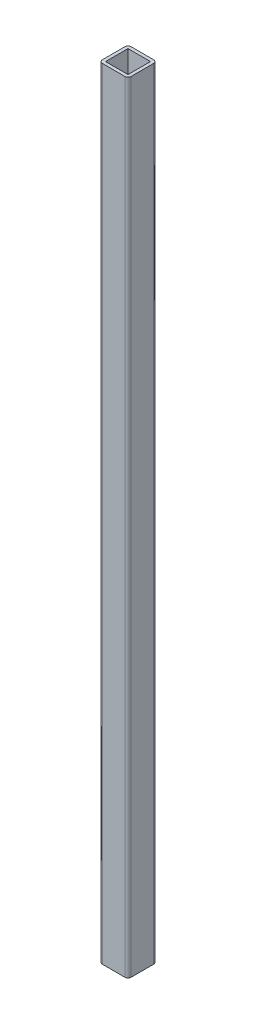
ISO-10303-21;
HEADER;
FILE_DESCRIPTION(('STEP AP214'),'2;1');
FILE_NAME('part.step','',(''),(''),'','','');
FILE_SCHEMA(('AUTOMOTIVE_DESIGN { 1 0 10303 214 1 1 1 1 }'));
ENDSEC;
DATA;
#1=APPLICATION_CONTEXT('core data for automotive mechanical design processes');
#2=APPLICATION_PROTOCOL_DEFINITION('international standard','automotive_design',2000,#1);
#3=PRODUCT_CONTEXT('',#1,'mechanical');
#4=PRODUCT('Part','Part','',(#3));
#5=PRODUCT_RELATED_PRODUCT_CATEGORY('part','',(#4));
#6=PRODUCT_DEFINITION_FORMATION('','',#4);
#7=PRODUCT_DEFINITION_CONTEXT('part definition',#1,'design');
#8=PRODUCT_DEFINITION('design','',#6,#7);
#9=PRODUCT_DEFINITION_SHAPE('','',#8);
#10=(LENGTH_UNIT() NAMED_UNIT(*) SI_UNIT(.MILLI.,.METRE.));
#11=(NAMED_UNIT(*) PLANE_ANGLE_UNIT() SI_UNIT($,.RADIAN.));
#12=(NAMED_UNIT(*) SI_UNIT($,.STERADIAN.) SOLID_ANGLE_UNIT());
#13=UNCERTAINTY_MEASURE_WITH_UNIT(LENGTH_MEASURE(1.E-05),#10,'distance_accuracy_value','');
#14=(GEOMETRIC_REPRESENTATION_CONTEXT(3) GLOBAL_UNCERTAINTY_ASSIGNED_CONTEXT((#13)) GLOBAL_UNIT_ASSIGNED_CONTEXT((#10,
#11,#12)) REPRESENTATION_CONTEXT('',''));
#15=CARTESIAN_POINT('',(0.,0.,0.));
#16=DIRECTION('',(0.,0.,1.));
#17=DIRECTION('',(1.,0.,0.));
#18=AXIS2_PLACEMENT_3D('',#15,#16,#17);
#19=CARTESIAN_POINT('',(22.8,693.,2.8));
#20=DIRECTION('',(0.,-1.,0.));
#21=DIRECTION('',(0.,0.,-1.));
#22=AXIS2_PLACEMENT_3D('',#19,#20,#21);
#23=CYLINDRICAL_SURFACE('',#22,2.8);
#24=CARTESIAN_POINT('',(22.8,0.,2.8));
#25=DIRECTION('',(0.,1.,0.));
#26=DIRECTION('',(0.,0.,-1.));
#27=AXIS2_PLACEMENT_3D('',#24,#25,#26);
#28=CIRCLE('',#27,2.8);
#29=CARTESIAN_POINT('',(25.6,0.,2.80000000000002));
#30=VERTEX_POINT('',#29);
#31=CARTESIAN_POINT('',(22.8,0.,0.));
#32=VERTEX_POINT('',#31);
#33=EDGE_CURVE('E155',#30,#32,#28,.T.);
#34=ORIENTED_EDGE('',*,*,#33,.T.);
#35=DIRECTION('',(0.,-1.,0.));
#36=VECTOR('',#35,1.);
#37=CARTESIAN_POINT('',(22.8,693.,0.));
#38=LINE('',#37,#36);
#39=CARTESIAN_POINT('',(22.8,693.,0.));
#40=VERTEX_POINT('',#39);
#41=EDGE_CURVE('E11',#40,#32,#38,.T.);
#42=ORIENTED_EDGE('',*,*,#41,.F.);
#43=CARTESIAN_POINT('',(22.8,693.,2.8));
#44=DIRECTION('',(0.,1.,0.));
#45=DIRECTION('',(0.,0.,-1.));
#46=AXIS2_PLACEMENT_3D('',#43,#44,#45);
#47=CIRCLE('',#46,2.8);
#48=CARTESIAN_POINT('',(25.6,693.,2.80000000000002));
#49=VERTEX_POINT('',#48);
#50=EDGE_CURVE('E159',#49,#40,#47,.T.);
#51=ORIENTED_EDGE('',*,*,#50,.F.);
#52=DIRECTION('',(0.,-1.,0.));
#53=VECTOR('',#52,1.);
#54=CARTESIAN_POINT('',(25.6,693.,2.80000000000002));
#55=LINE('',#54,#53);
#56=EDGE_CURVE('E177',#49,#30,#55,.T.);
#57=ORIENTED_EDGE('',*,*,#56,.T.);
#58=EDGE_LOOP('',(#34,#42,#51,#57));
#59=FACE_BOUND('',#58,.T.);
#60=ADVANCED_FACE('F34',(#59),#23,.T.);
#61=CARTESIAN_POINT('',(2.80000000000002,693.,0.));
#62=DIRECTION('',(0.,0.,1.));
#63=DIRECTION('',(1.,0.,0.));
#64=AXIS2_PLACEMENT_3D('',#61,#62,#63);
#65=PLANE('',#64);
#66=DIRECTION('',(-1.,0.,0.));
#67=VECTOR('',#66,1.);
#68=CARTESIAN_POINT('',(2.80000000000002,0.,0.));
#69=LINE('',#68,#67);
#70=CARTESIAN_POINT('',(2.80000000000002,0.,0.));
#71=VERTEX_POINT('',#70);
#72=EDGE_CURVE('E180',#32,#71,#69,.T.);
#73=ORIENTED_EDGE('',*,*,#72,.T.);
#74=DIRECTION('',(0.,-1.,0.));
#75=VECTOR('',#74,1.);
#76=CARTESIAN_POINT('',(2.80000000000002,693.,0.));
#77=LINE('',#76,#75);
#78=CARTESIAN_POINT('',(2.80000000000002,693.,0.));
#79=VERTEX_POINT('',#78);
#80=EDGE_CURVE('E41',#79,#71,#77,.T.);
#81=ORIENTED_EDGE('',*,*,#80,.F.);
#82=DIRECTION('',(-1.,0.,0.));
#83=VECTOR('',#82,1.);
#84=CARTESIAN_POINT('',(2.80000000000002,693.,0.));
#85=LINE('',#84,#83);
#86=EDGE_CURVE('E162',#40,#79,#85,.T.);
#87=ORIENTED_EDGE('',*,*,#86,.F.);
#88=ORIENTED_EDGE('',*,*,#41,.T.);
#89=EDGE_LOOP('',(#73,#81,#87,#88));
#90=FACE_BOUND('',#89,.T.);
#91=ADVANCED_FACE('F235',(#90),#65,.F.);
#92=CARTESIAN_POINT('',(2.8,693.,2.8));
#93=DIRECTION('',(0.,-1.,0.));
#94=DIRECTION('',(0.,0.,-1.));
#95=AXIS2_PLACEMENT_3D('',#92,#93,#94);
#96=CYLINDRICAL_SURFACE('',#95,2.8);
#97=CARTESIAN_POINT('',(2.8,0.,2.8));
#98=DIRECTION('',(0.,1.,0.));
#99=DIRECTION('',(0.,0.,1.));
#100=AXIS2_PLACEMENT_3D('',#97,#98,#99);
#101=CIRCLE('',#100,2.8);
#102=CARTESIAN_POINT('',(0.,0.,2.80000000000002));
#103=VERTEX_POINT('',#102);
#104=EDGE_CURVE('E182',#71,#103,#101,.T.);
#105=ORIENTED_EDGE('',*,*,#104,.T.);
#106=DIRECTION('',(0.,-1.,0.));
#107=VECTOR('',#106,1.);
#108=CARTESIAN_POINT('',(0.,693.,2.80000000000002));
#109=LINE('',#108,#107);
#110=CARTESIAN_POINT('',(0.,693.,2.80000000000002));
#111=VERTEX_POINT('',#110);
#112=EDGE_CURVE('E207',#111,#103,#109,.T.);
#113=ORIENTED_EDGE('',*,*,#112,.F.);
#114=CARTESIAN_POINT('',(2.8,693.,2.8));
#115=DIRECTION('',(0.,1.,0.));
#116=DIRECTION('',(0.,0.,1.));
#117=AXIS2_PLACEMENT_3D('',#114,#115,#116);
#118=CIRCLE('',#117,2.8);
#119=EDGE_CURVE('E165',#79,#111,#118,.T.);
#120=ORIENTED_EDGE('',*,*,#119,.F.);
#121=ORIENTED_EDGE('',*,*,#80,.T.);
#122=EDGE_LOOP('',(#105,#113,#120,#121));
#123=FACE_BOUND('',#122,.T.);
#124=ADVANCED_FACE('F214',(#123),#96,.T.);
#125=CARTESIAN_POINT('',(0.,693.,2.80000000000002));
#126=DIRECTION('',(1.,0.,0.));
#127=DIRECTION('',(0.,0.,-1.));
#128=AXIS2_PLACEMENT_3D('',#125,#126,#127);
#129=PLANE('',#128);
#130=DIRECTION('',(0.,0.,1.));
#131=VECTOR('',#130,1.);
#132=CARTESIAN_POINT('',(0.,0.,2.80000000000002));
#133=LINE('',#132,#131);
#134=CARTESIAN_POINT('',(0.,0.,22.8));
#135=VERTEX_POINT('',#134);
#136=EDGE_CURVE('E184',#103,#135,#133,.T.);
#137=ORIENTED_EDGE('',*,*,#136,.T.);
#138=DIRECTION('',(0.,-1.,0.));
#139=VECTOR('',#138,1.);
#140=CARTESIAN_POINT('',(0.,693.,22.8));
#141=LINE('',#140,#139);
#142=CARTESIAN_POINT('',(0.,693.,22.8));
#143=VERTEX_POINT('',#142);
#144=EDGE_CURVE('E204',#143,#135,#141,.T.);
#145=ORIENTED_EDGE('',*,*,#144,.F.);
#146=DIRECTION('',(0.,0.,1.));
#147=VECTOR('',#146,1.);
#148=CARTESIAN_POINT('',(0.,693.,2.80000000000002));
#149=LINE('',#148,#147);
#150=EDGE_CURVE('E167',#111,#143,#149,.T.);
#151=ORIENTED_EDGE('',*,*,#150,.F.);
#152=ORIENTED_EDGE('',*,*,#112,.T.);
#153=EDGE_LOOP('',(#137,#145,#151,#152));
#154=FACE_BOUND('',#153,.T.);
#155=ADVANCED_FACE('F225',(#154),#129,.F.);
#156=CARTESIAN_POINT('',(2.8,693.,22.8));
#157=DIRECTION('',(0.,-1.,0.));
#158=DIRECTION('',(0.,0.,-1.));
#159=AXIS2_PLACEMENT_3D('',#156,#157,#158);
#160=CYLINDRICAL_SURFACE('',#159,2.8);
#161=CARTESIAN_POINT('',(2.8,0.,22.8));
#162=DIRECTION('',(0.,1.,0.));
#163=DIRECTION('',(0.,0.,1.));
#164=AXIS2_PLACEMENT_3D('',#161,#162,#163);
#165=CIRCLE('',#164,2.8);
#166=CARTESIAN_POINT('',(2.80000000000002,0.,25.6));
#167=VERTEX_POINT('',#166);
#168=EDGE_CURVE('E186',#135,#167,#165,.T.);
#169=ORIENTED_EDGE('',*,*,#168,.T.);
#170=DIRECTION('',(0.,-1.,0.));
#171=VECTOR('',#170,1.);
#172=CARTESIAN_POINT('',(2.80000000000002,693.,25.6));
#173=LINE('',#172,#171);
#174=CARTESIAN_POINT('',(2.80000000000002,693.,25.6));
#175=VERTEX_POINT('',#174);
#176=EDGE_CURVE('E201',#175,#167,#173,.T.);
#177=ORIENTED_EDGE('',*,*,#176,.F.);
#178=CARTESIAN_POINT('',(2.8,693.,22.8));
#179=DIRECTION('',(0.,1.,0.));
#180=DIRECTION('',(0.,0.,1.));
#181=AXIS2_PLACEMENT_3D('',#178,#179,#180);
#182=CIRCLE('',#181,2.8);
#183=EDGE_CURVE('E169',#143,#175,#182,.T.);
#184=ORIENTED_EDGE('',*,*,#183,.F.);
#185=ORIENTED_EDGE('',*,*,#144,.T.);
#186=EDGE_LOOP('',(#169,#177,#184,#185));
#187=FACE_BOUND('',#186,.T.);
#188=ADVANCED_FACE('F229',(#187),#160,.T.);
#189=CARTESIAN_POINT('',(2.80000000000002,693.,25.6));
#190=DIRECTION('',(0.,0.,-1.));
#191=DIRECTION('',(-1.,0.,0.));
#192=AXIS2_PLACEMENT_3D('',#189,#190,#191);
#193=PLANE('',#192);
#194=DIRECTION('',(1.,0.,0.));
#195=VECTOR('',#194,1.);
#196=CARTESIAN_POINT('',(2.80000000000002,0.,25.6));
#197=LINE('',#196,#195);
#198=CARTESIAN_POINT('',(22.8,0.,25.6));
#199=VERTEX_POINT('',#198);
#200=EDGE_CURVE('E188',#167,#199,#197,.T.);
#201=ORIENTED_EDGE('',*,*,#200,.T.);
#202=DIRECTION('',(0.,-1.,0.));
#203=VECTOR('',#202,1.);
#204=CARTESIAN_POINT('',(22.8,693.,25.6));
#205=LINE('',#204,#203);
#206=CARTESIAN_POINT('',(22.8,693.,25.6));
#207=VERTEX_POINT('',#206);
#208=EDGE_CURVE('E198',#207,#199,#205,.T.);
#209=ORIENTED_EDGE('',*,*,#208,.F.);
#210=DIRECTION('',(1.,0.,0.));
#211=VECTOR('',#210,1.);
#212=CARTESIAN_POINT('',(2.80000000000002,693.,25.6));
#213=LINE('',#212,#211);
#214=EDGE_CURVE('E171',#175,#207,#213,.T.);
#215=ORIENTED_EDGE('',*,*,#214,.F.);
#216=ORIENTED_EDGE('',*,*,#176,.T.);
#217=EDGE_LOOP('',(#201,#209,#215,#216));
#218=FACE_BOUND('',#217,.T.);
#219=ADVANCED_FACE('F248',(#218),#193,.F.);
#220=CARTESIAN_POINT('',(22.8,693.,22.8));
#221=DIRECTION('',(0.,-1.,0.));
#222=DIRECTION('',(0.,0.,-1.));
#223=AXIS2_PLACEMENT_3D('',#220,#221,#222);
#224=CYLINDRICAL_SURFACE('',#223,2.8);
#225=CARTESIAN_POINT('',(22.8,0.,22.8));
#226=DIRECTION('',(0.,1.,0.));
#227=DIRECTION('',(0.,0.,1.));
#228=AXIS2_PLACEMENT_3D('',#225,#226,#227);
#229=CIRCLE('',#228,2.8);
#230=CARTESIAN_POINT('',(25.6,0.,22.8));
#231=VERTEX_POINT('',#230);
#232=EDGE_CURVE('E190',#199,#231,#229,.T.);
#233=ORIENTED_EDGE('',*,*,#232,.T.);
#234=DIRECTION('',(0.,-1.,0.));
#235=VECTOR('',#234,1.);
#236=CARTESIAN_POINT('',(25.6,693.,22.8));
#237=LINE('',#236,#235);
#238=CARTESIAN_POINT('',(25.6,693.,22.8));
#239=VERTEX_POINT('',#238);
#240=EDGE_CURVE('E195',#239,#231,#237,.T.);
#241=ORIENTED_EDGE('',*,*,#240,.F.);
#242=CARTESIAN_POINT('',(22.8,693.,22.8));
#243=DIRECTION('',(0.,1.,0.));
#244=DIRECTION('',(0.,0.,1.));
#245=AXIS2_PLACEMENT_3D('',#242,#243,#244);
#246=CIRCLE('',#245,2.8);
#247=EDGE_CURVE('E173',#207,#239,#246,.T.);
#248=ORIENTED_EDGE('',*,*,#247,.F.);
#249=ORIENTED_EDGE('',*,*,#208,.T.);
#250=EDGE_LOOP('',(#233,#241,#248,#249));
#251=FACE_BOUND('',#250,.T.);
#252=ADVANCED_FACE('F246',(#251),#224,.T.);
#253=CARTESIAN_POINT('',(25.6,693.,2.80000000000002));
#254=DIRECTION('',(-1.,0.,0.));
#255=DIRECTION('',(0.,0.,1.));
#256=AXIS2_PLACEMENT_3D('',#253,#254,#255);
#257=PLANE('',#256);
#258=DIRECTION('',(0.,0.,-1.));
#259=VECTOR('',#258,1.);
#260=CARTESIAN_POINT('',(25.6,0.,2.80000000000002));
#261=LINE('',#260,#259);
#262=EDGE_CURVE('E163',#231,#30,#261,.T.);
#263=ORIENTED_EDGE('',*,*,#262,.T.);
#264=ORIENTED_EDGE('',*,*,#56,.F.);
#265=DIRECTION('',(0.,0.,-1.));
#266=VECTOR('',#265,1.);
#267=CARTESIAN_POINT('',(25.6,693.,2.80000000000002));
#268=LINE('',#267,#266);
#269=EDGE_CURVE('E175',#239,#49,#268,.T.);
#270=ORIENTED_EDGE('',*,*,#269,.F.);
#271=ORIENTED_EDGE('',*,*,#240,.T.);
#272=EDGE_LOOP('',(#263,#264,#270,#271));
#273=FACE_BOUND('',#272,.T.);
#274=ADVANCED_FACE('F241',(#273),#257,.F.);
#275=CARTESIAN_POINT('',(22.8,693.,2.8));
#276=DIRECTION('',(0.,-1.,0.));
#277=DIRECTION('',(0.,0.,-1.));
#278=AXIS2_PLACEMENT_3D('',#275,#276,#277);
#279=PLANE('',#278);
#280=DIRECTION('',(1.,0.,0.));
#281=VECTOR('',#280,1.);
#282=CARTESIAN_POINT('',(2.8,693.,2.8));
#283=LINE('',#282,#281);
#284=CARTESIAN_POINT('',(2.8,693.,2.8));
#285=VERTEX_POINT('',#284);
#286=CARTESIAN_POINT('',(22.8,693.,2.8));
#287=VERTEX_POINT('',#286);
#288=EDGE_CURVE('E130',#285,#287,#283,.T.);
#289=ORIENTED_EDGE('',*,*,#288,.T.);
#290=DIRECTION('',(0.,0.,1.));
#291=VECTOR('',#290,1.);
#292=CARTESIAN_POINT('',(22.8,693.,2.8));
#293=LINE('',#292,#291);
#294=CARTESIAN_POINT('',(22.8,693.,22.8));
#295=VERTEX_POINT('',#294);
#296=EDGE_CURVE('E124',#287,#295,#293,.T.);
#297=ORIENTED_EDGE('',*,*,#296,.T.);
#298=DIRECTION('',(-1.,0.,0.));
#299=VECTOR('',#298,1.);
#300=CARTESIAN_POINT('',(2.8,693.,22.8));
#301=LINE('',#300,#299);
#302=CARTESIAN_POINT('',(2.8,693.,22.8));
#303=VERTEX_POINT('',#302);
#304=EDGE_CURVE('E133',#295,#303,#301,.T.);
#305=ORIENTED_EDGE('',*,*,#304,.T.);
#306=DIRECTION('',(0.,0.,-1.));
#307=VECTOR('',#306,1.);
#308=CARTESIAN_POINT('',(2.8,693.,2.8));
#309=LINE('',#308,#307);
#310=EDGE_CURVE('E48',#303,#285,#309,.T.);
#311=ORIENTED_EDGE('',*,*,#310,.T.);
#312=EDGE_LOOP('',(#289,#297,#305,#311));
#313=FACE_BOUND('',#312,.T.);
#314=ORIENTED_EDGE('',*,*,#50,.T.);
#315=ORIENTED_EDGE('',*,*,#86,.T.);
#316=ORIENTED_EDGE('',*,*,#119,.T.);
#317=ORIENTED_EDGE('',*,*,#150,.T.);
#318=ORIENTED_EDGE('',*,*,#183,.T.);
#319=ORIENTED_EDGE('',*,*,#214,.T.);
#320=ORIENTED_EDGE('',*,*,#247,.T.);
#321=ORIENTED_EDGE('',*,*,#269,.T.);
#322=EDGE_LOOP('',(#314,#315,#316,#317,#318,#319,#320,#321));
#323=FACE_BOUND('',#322,.T.);
#324=ADVANCED_FACE('F137',(#313,#323),#279,.F.);
#325=CARTESIAN_POINT('',(22.8,0.,2.8));
#326=DIRECTION('',(0.,-1.,0.));
#327=DIRECTION('',(0.,0.,-1.));
#328=AXIS2_PLACEMENT_3D('',#325,#326,#327);
#329=PLANE('',#328);
#330=DIRECTION('',(0.,0.,1.));
#331=VECTOR('',#330,1.);
#332=CARTESIAN_POINT('',(22.8,0.,2.8));
#333=LINE('',#332,#331);
#334=CARTESIAN_POINT('',(22.8,0.,2.8));
#335=VERTEX_POINT('',#334);
#336=CARTESIAN_POINT('',(22.8,0.,22.8));
#337=VERTEX_POINT('',#336);
#338=EDGE_CURVE('E56',#335,#337,#333,.T.);
#339=ORIENTED_EDGE('',*,*,#338,.F.);
#340=DIRECTION('',(1.,0.,0.));
#341=VECTOR('',#340,1.);
#342=CARTESIAN_POINT('',(2.8,0.,2.8));
#343=LINE('',#342,#341);
#344=CARTESIAN_POINT('',(2.8,0.,2.8));
#345=VERTEX_POINT('',#344);
#346=EDGE_CURVE('E140',#345,#335,#343,.T.);
#347=ORIENTED_EDGE('',*,*,#346,.F.);
#348=DIRECTION('',(0.,0.,-1.));
#349=VECTOR('',#348,1.);
#350=CARTESIAN_POINT('',(2.8,0.,2.8));
#351=LINE('',#350,#349);
#352=CARTESIAN_POINT('',(2.8,0.,22.8));
#353=VERTEX_POINT('',#352);
#354=EDGE_CURVE('E143',#353,#345,#351,.T.);
#355=ORIENTED_EDGE('',*,*,#354,.F.);
#356=DIRECTION('',(-1.,0.,0.));
#357=VECTOR('',#356,1.);
#358=CARTESIAN_POINT('',(2.8,0.,22.8));
#359=LINE('',#358,#357);
#360=EDGE_CURVE('E149',#337,#353,#359,.T.);
#361=ORIENTED_EDGE('',*,*,#360,.F.);
#362=EDGE_LOOP('',(#339,#347,#355,#361));
#363=FACE_BOUND('',#362,.T.);
#364=ORIENTED_EDGE('',*,*,#33,.F.);
#365=ORIENTED_EDGE('',*,*,#262,.F.);
#366=ORIENTED_EDGE('',*,*,#232,.F.);
#367=ORIENTED_EDGE('',*,*,#200,.F.);
#368=ORIENTED_EDGE('',*,*,#168,.F.);
#369=ORIENTED_EDGE('',*,*,#136,.F.);
#370=ORIENTED_EDGE('',*,*,#104,.F.);
#371=ORIENTED_EDGE('',*,*,#72,.F.);
#372=EDGE_LOOP('',(#364,#365,#366,#367,#368,#369,#370,#371));
#373=FACE_BOUND('',#372,.T.);
#374=ADVANCED_FACE('F220',(#363,#373),#329,.T.);
#375=CARTESIAN_POINT('',(22.8,693.,2.8));
#376=DIRECTION('',(1.,0.,0.));
#377=DIRECTION('',(0.,0.,-1.));
#378=AXIS2_PLACEMENT_3D('',#375,#376,#377);
#379=PLANE('',#378);
#380=ORIENTED_EDGE('',*,*,#338,.T.);
#381=DIRECTION('',(0.,-1.,0.));
#382=VECTOR('',#381,1.);
#383=CARTESIAN_POINT('',(22.8,693.,22.8));
#384=LINE('',#383,#382);
#385=EDGE_CURVE('E120',#295,#337,#384,.T.);
#386=ORIENTED_EDGE('',*,*,#385,.F.);
#387=ORIENTED_EDGE('',*,*,#296,.F.);
#388=DIRECTION('',(0.,-1.,0.));
#389=VECTOR('',#388,1.);
#390=CARTESIAN_POINT('',(22.8,693.,2.8));
#391=LINE('',#390,#389);
#392=EDGE_CURVE('E153',#287,#335,#391,.T.);
#393=ORIENTED_EDGE('',*,*,#392,.T.);
#394=EDGE_LOOP('',(#380,#386,#387,#393));
#395=FACE_BOUND('',#394,.T.);
#396=ADVANCED_FACE('F122',(#395),#379,.F.);
#397=CARTESIAN_POINT('',(2.8,693.,2.8));
#398=DIRECTION('',(0.,0.,-1.));
#399=DIRECTION('',(-1.,0.,0.));
#400=AXIS2_PLACEMENT_3D('',#397,#398,#399);
#401=PLANE('',#400);
#402=ORIENTED_EDGE('',*,*,#346,.T.);
#403=ORIENTED_EDGE('',*,*,#392,.F.);
#404=ORIENTED_EDGE('',*,*,#288,.F.);
#405=DIRECTION('',(0.,-1.,0.));
#406=VECTOR('',#405,1.);
#407=CARTESIAN_POINT('',(2.8,693.,2.8));
#408=LINE('',#407,#406);
#409=EDGE_CURVE('E156',#285,#345,#408,.T.);
#410=ORIENTED_EDGE('',*,*,#409,.T.);
#411=EDGE_LOOP('',(#402,#403,#404,#410));
#412=FACE_BOUND('',#411,.T.);
#413=ADVANCED_FACE('F319',(#412),#401,.F.);
#414=CARTESIAN_POINT('',(2.8,693.,2.8));
#415=DIRECTION('',(-1.,0.,0.));
#416=DIRECTION('',(0.,0.,1.));
#417=AXIS2_PLACEMENT_3D('',#414,#415,#416);
#418=PLANE('',#417);
#419=ORIENTED_EDGE('',*,*,#354,.T.);
#420=ORIENTED_EDGE('',*,*,#409,.F.);
#421=ORIENTED_EDGE('',*,*,#310,.F.);
#422=DIRECTION('',(0.,-1.,0.));
#423=VECTOR('',#422,1.);
#424=CARTESIAN_POINT('',(2.8,693.,22.8));
#425=LINE('',#424,#423);
#426=EDGE_CURVE('E129',#303,#353,#425,.T.);
#427=ORIENTED_EDGE('',*,*,#426,.T.);
#428=EDGE_LOOP('',(#419,#420,#421,#427));
#429=FACE_BOUND('',#428,.T.);
#430=ADVANCED_FACE('F328',(#429),#418,.F.);
#431=CARTESIAN_POINT('',(2.8,693.,22.8));
#432=DIRECTION('',(0.,0.,1.));
#433=DIRECTION('',(1.,0.,0.));
#434=AXIS2_PLACEMENT_3D('',#431,#432,#433);
#435=PLANE('',#434);
#436=ORIENTED_EDGE('',*,*,#360,.T.);
#437=ORIENTED_EDGE('',*,*,#426,.F.);
#438=ORIENTED_EDGE('',*,*,#304,.F.);
#439=ORIENTED_EDGE('',*,*,#385,.T.);
#440=EDGE_LOOP('',(#436,#437,#438,#439));
#441=FACE_BOUND('',#440,.T.);
#442=ADVANCED_FACE('F134',(#441),#435,.F.);
#443=CLOSED_SHELL('',(#60,#91,#124,#155,#188,#219,#252,#274,#324,#374,#396,#413,#430,#442));
#444=MANIFOLD_SOLID_BREP('B2',#443);
#445=ADVANCED_BREP_SHAPE_REPRESENTATION('',(#18,#444),#14);
#446=SHAPE_DEFINITION_REPRESENTATION(#9,#445);
ENDSEC;
END-ISO-10303-21;
